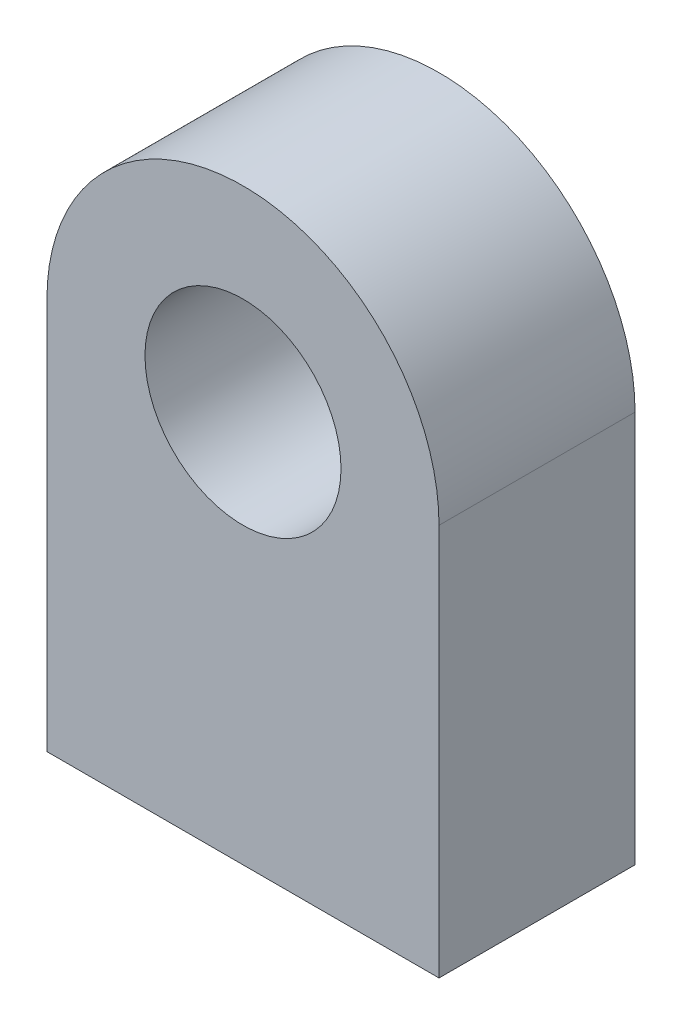
ISO-10303-21;
HEADER;
FILE_DESCRIPTION(('STEP AP214'),'2;1');
FILE_NAME('part.step','',(''),(''),'','','');
FILE_SCHEMA(('AUTOMOTIVE_DESIGN { 1 0 10303 214 1 1 1 1 }'));
ENDSEC;
DATA;
#1=APPLICATION_CONTEXT('core data for automotive mechanical design processes');
#2=APPLICATION_PROTOCOL_DEFINITION('international standard','automotive_design',2000,#1);
#3=PRODUCT_CONTEXT('',#1,'mechanical');
#4=PRODUCT('Part','Part','',(#3));
#5=PRODUCT_RELATED_PRODUCT_CATEGORY('part','',(#4));
#6=PRODUCT_DEFINITION_FORMATION('','',#4);
#7=PRODUCT_DEFINITION_CONTEXT('part definition',#1,'design');
#8=PRODUCT_DEFINITION('design','',#6,#7);
#9=PRODUCT_DEFINITION_SHAPE('','',#8);
#10=(LENGTH_UNIT() NAMED_UNIT(*) SI_UNIT(.MILLI.,.METRE.));
#11=(NAMED_UNIT(*) PLANE_ANGLE_UNIT() SI_UNIT($,.RADIAN.));
#12=(NAMED_UNIT(*) SI_UNIT($,.STERADIAN.) SOLID_ANGLE_UNIT());
#13=UNCERTAINTY_MEASURE_WITH_UNIT(LENGTH_MEASURE(1.E-05),#10,'distance_accuracy_value','');
#14=(GEOMETRIC_REPRESENTATION_CONTEXT(3) GLOBAL_UNCERTAINTY_ASSIGNED_CONTEXT((#13)) GLOBAL_UNIT_ASSIGNED_CONTEXT((#10,
#11,#12)) REPRESENTATION_CONTEXT('',''));
#15=CARTESIAN_POINT('',(0.,0.,0.));
#16=DIRECTION('',(0.,0.,1.));
#17=DIRECTION('',(1.,0.,0.));
#18=AXIS2_PLACEMENT_3D('',#15,#16,#17);
#19=CARTESIAN_POINT('',(0.,0.,6.35));
#20=DIRECTION('',(0.,0.,1.));
#21=DIRECTION('',(1.,0.,0.));
#22=AXIS2_PLACEMENT_3D('',#19,#20,#21);
#23=PLANE('',#22);
#24=DIRECTION('',(0.,1.,0.));
#25=VECTOR('',#24,1.);
#26=CARTESIAN_POINT('',(6.35,0.,6.35));
#27=LINE('',#26,#25);
#28=CARTESIAN_POINT('',(6.35,-12.7,6.35));
#29=VERTEX_POINT('',#28);
#30=CARTESIAN_POINT('',(6.35,0.,6.35));
#31=VERTEX_POINT('',#30);
#32=EDGE_CURVE('E85',#29,#31,#27,.T.);
#33=ORIENTED_EDGE('',*,*,#32,.T.);
#34=CARTESIAN_POINT('',(0.,0.,6.35));
#35=DIRECTION('',(0.,0.,1.));
#36=DIRECTION('',(1.,0.,0.));
#37=AXIS2_PLACEMENT_3D('',#34,#35,#36);
#38=CIRCLE('',#37,6.35);
#39=CARTESIAN_POINT('',(-6.35,0.,6.35));
#40=VERTEX_POINT('',#39);
#41=EDGE_CURVE('E80',#31,#40,#38,.T.);
#42=ORIENTED_EDGE('',*,*,#41,.T.);
#43=DIRECTION('',(0.,-1.,0.));
#44=VECTOR('',#43,1.);
#45=CARTESIAN_POINT('',(-6.35,0.,6.35));
#46=LINE('',#45,#44);
#47=CARTESIAN_POINT('',(-6.35,-12.7,6.35));
#48=VERTEX_POINT('',#47);
#49=EDGE_CURVE('E83',#40,#48,#46,.T.);
#50=ORIENTED_EDGE('',*,*,#49,.T.);
#51=DIRECTION('',(1.,0.,0.));
#52=VECTOR('',#51,1.);
#53=CARTESIAN_POINT('',(-6.35,-12.7,6.35));
#54=LINE('',#53,#52);
#55=EDGE_CURVE('E50',#48,#29,#54,.T.);
#56=ORIENTED_EDGE('',*,*,#55,.T.);
#57=EDGE_LOOP('',(#33,#42,#50,#56));
#58=FACE_BOUND('',#57,.T.);
#59=CARTESIAN_POINT('',(0.,0.,6.35));
#60=DIRECTION('',(0.,0.,1.));
#61=DIRECTION('',(1.,0.,0.));
#62=AXIS2_PLACEMENT_3D('',#59,#60,#61);
#63=CIRCLE('',#62,3.175);
#64=CARTESIAN_POINT('',(3.175,0.,6.35));
#65=VERTEX_POINT('',#64);
#66=EDGE_CURVE('E100',#65,#65,#63,.T.);
#67=ORIENTED_EDGE('',*,*,#66,.F.);
#68=EDGE_LOOP('',(#67));
#69=FACE_BOUND('',#68,.T.);
#70=ADVANCED_FACE('F33',(#58,#69),#23,.T.);
#71=CARTESIAN_POINT('',(0.,0.,0.));
#72=DIRECTION('',(0.,0.,1.));
#73=DIRECTION('',(1.,0.,0.));
#74=AXIS2_PLACEMENT_3D('',#71,#72,#73);
#75=PLANE('',#74);
#76=DIRECTION('',(0.,1.,0.));
#77=VECTOR('',#76,1.);
#78=CARTESIAN_POINT('',(6.35,0.,0.));
#79=LINE('',#78,#77);
#80=CARTESIAN_POINT('',(6.35,-12.7,0.));
#81=VERTEX_POINT('',#80);
#82=CARTESIAN_POINT('',(6.35,0.,0.));
#83=VERTEX_POINT('',#82);
#84=EDGE_CURVE('E97',#81,#83,#79,.T.);
#85=ORIENTED_EDGE('',*,*,#84,.F.);
#86=DIRECTION('',(1.,0.,0.));
#87=VECTOR('',#86,1.);
#88=CARTESIAN_POINT('',(-6.35,-12.7,0.));
#89=LINE('',#88,#87);
#90=CARTESIAN_POINT('',(-6.35,-12.7,0.));
#91=VERTEX_POINT('',#90);
#92=EDGE_CURVE('E73',#91,#81,#89,.T.);
#93=ORIENTED_EDGE('',*,*,#92,.F.);
#94=DIRECTION('',(0.,-1.,0.));
#95=VECTOR('',#94,1.);
#96=CARTESIAN_POINT('',(-6.35,0.,0.));
#97=LINE('',#96,#95);
#98=CARTESIAN_POINT('',(-6.35,0.,0.));
#99=VERTEX_POINT('',#98);
#100=EDGE_CURVE('E67',#99,#91,#97,.T.);
#101=ORIENTED_EDGE('',*,*,#100,.F.);
#102=CARTESIAN_POINT('',(0.,0.,0.));
#103=DIRECTION('',(0.,0.,1.));
#104=DIRECTION('',(1.,0.,0.));
#105=AXIS2_PLACEMENT_3D('',#102,#103,#104);
#106=CIRCLE('',#105,6.35);
#107=EDGE_CURVE('E89',#83,#99,#106,.T.);
#108=ORIENTED_EDGE('',*,*,#107,.F.);
#109=EDGE_LOOP('',(#85,#93,#101,#108));
#110=FACE_BOUND('',#109,.T.);
#111=CARTESIAN_POINT('',(0.,0.,0.));
#112=DIRECTION('',(0.,0.,1.));
#113=DIRECTION('',(1.,0.,0.));
#114=AXIS2_PLACEMENT_3D('',#111,#112,#113);
#115=CIRCLE('',#114,3.175);
#116=CARTESIAN_POINT('',(3.175,0.,0.));
#117=VERTEX_POINT('',#116);
#118=EDGE_CURVE('E112',#117,#117,#115,.T.);
#119=ORIENTED_EDGE('',*,*,#118,.T.);
#120=EDGE_LOOP('',(#119));
#121=FACE_BOUND('',#120,.T.);
#122=ADVANCED_FACE('F108',(#110,#121),#75,.F.);
#123=CARTESIAN_POINT('',(6.35,0.,6.35));
#124=DIRECTION('',(-1.,0.,0.));
#125=DIRECTION('',(0.,-1.,0.));
#126=AXIS2_PLACEMENT_3D('',#123,#124,#125);
#127=PLANE('',#126);
#128=ORIENTED_EDGE('',*,*,#84,.T.);
#129=DIRECTION('',(0.,0.,-1.));
#130=VECTOR('',#129,1.);
#131=CARTESIAN_POINT('',(6.35,0.,6.35));
#132=LINE('',#131,#130);
#133=EDGE_CURVE('E11',#31,#83,#132,.T.);
#134=ORIENTED_EDGE('',*,*,#133,.F.);
#135=ORIENTED_EDGE('',*,*,#32,.F.);
#136=DIRECTION('',(0.,0.,-1.));
#137=VECTOR('',#136,1.);
#138=CARTESIAN_POINT('',(6.35,-12.7,6.35));
#139=LINE('',#138,#137);
#140=EDGE_CURVE('E93',#29,#81,#139,.T.);
#141=ORIENTED_EDGE('',*,*,#140,.T.);
#142=EDGE_LOOP('',(#128,#134,#135,#141));
#143=FACE_BOUND('',#142,.T.);
#144=ADVANCED_FACE('F35',(#143),#127,.F.);
#145=CARTESIAN_POINT('',(0.,0.,6.35));
#146=DIRECTION('',(0.,0.,-1.));
#147=DIRECTION('',(-1.,0.,0.));
#148=AXIS2_PLACEMENT_3D('',#145,#146,#147);
#149=CYLINDRICAL_SURFACE('',#148,6.35);
#150=ORIENTED_EDGE('',*,*,#107,.T.);
#151=DIRECTION('',(0.,0.,-1.));
#152=VECTOR('',#151,1.);
#153=CARTESIAN_POINT('',(-6.35,0.,6.35));
#154=LINE('',#153,#152);
#155=EDGE_CURVE('E42',#40,#99,#154,.T.);
#156=ORIENTED_EDGE('',*,*,#155,.F.);
#157=ORIENTED_EDGE('',*,*,#41,.F.);
#158=ORIENTED_EDGE('',*,*,#133,.T.);
#159=EDGE_LOOP('',(#150,#156,#157,#158));
#160=FACE_BOUND('',#159,.T.);
#161=ADVANCED_FACE('F88',(#160),#149,.T.);
#162=CARTESIAN_POINT('',(-6.35,0.,6.35));
#163=DIRECTION('',(1.,0.,0.));
#164=DIRECTION('',(0.,1.,0.));
#165=AXIS2_PLACEMENT_3D('',#162,#163,#164);
#166=PLANE('',#165);
#167=ORIENTED_EDGE('',*,*,#100,.T.);
#168=DIRECTION('',(0.,0.,-1.));
#169=VECTOR('',#168,1.);
#170=CARTESIAN_POINT('',(-6.35,-12.7,6.35));
#171=LINE('',#170,#169);
#172=EDGE_CURVE('E90',#48,#91,#171,.T.);
#173=ORIENTED_EDGE('',*,*,#172,.F.);
#174=ORIENTED_EDGE('',*,*,#49,.F.);
#175=ORIENTED_EDGE('',*,*,#155,.T.);
#176=EDGE_LOOP('',(#167,#173,#174,#175));
#177=FACE_BOUND('',#176,.T.);
#178=ADVANCED_FACE('F91',(#177),#166,.F.);
#179=CARTESIAN_POINT('',(-6.35,-12.7,6.35));
#180=DIRECTION('',(0.,1.,0.));
#181=DIRECTION('',(0.,0.,1.));
#182=AXIS2_PLACEMENT_3D('',#179,#180,#181);
#183=PLANE('',#182);
#184=ORIENTED_EDGE('',*,*,#92,.T.);
#185=ORIENTED_EDGE('',*,*,#140,.F.);
#186=ORIENTED_EDGE('',*,*,#55,.F.);
#187=ORIENTED_EDGE('',*,*,#172,.T.);
#188=EDGE_LOOP('',(#184,#185,#186,#187));
#189=FACE_BOUND('',#188,.T.);
#190=ADVANCED_FACE('F105',(#189),#183,.F.);
#191=CARTESIAN_POINT('',(0.,0.,6.35));
#192=DIRECTION('',(0.,0.,-1.));
#193=DIRECTION('',(-1.,0.,0.));
#194=AXIS2_PLACEMENT_3D('',#191,#192,#193);
#195=CYLINDRICAL_SURFACE('',#194,3.175);
#196=ORIENTED_EDGE('',*,*,#66,.T.);
#197=EDGE_LOOP('',(#196));
#198=FACE_BOUND('',#197,.T.);
#199=ORIENTED_EDGE('',*,*,#118,.F.);
#200=EDGE_LOOP('',(#199));
#201=FACE_BOUND('',#200,.T.);
#202=ADVANCED_FACE('F118',(#198,#201),#195,.F.);
#203=CLOSED_SHELL('',(#70,#122,#144,#161,#178,#190,#202));
#204=MANIFOLD_SOLID_BREP('B2',#203);
#205=ADVANCED_BREP_SHAPE_REPRESENTATION('',(#18,#204),#14);
#206=SHAPE_DEFINITION_REPRESENTATION(#9,#205);
ENDSEC;
END-ISO-10303-21;
